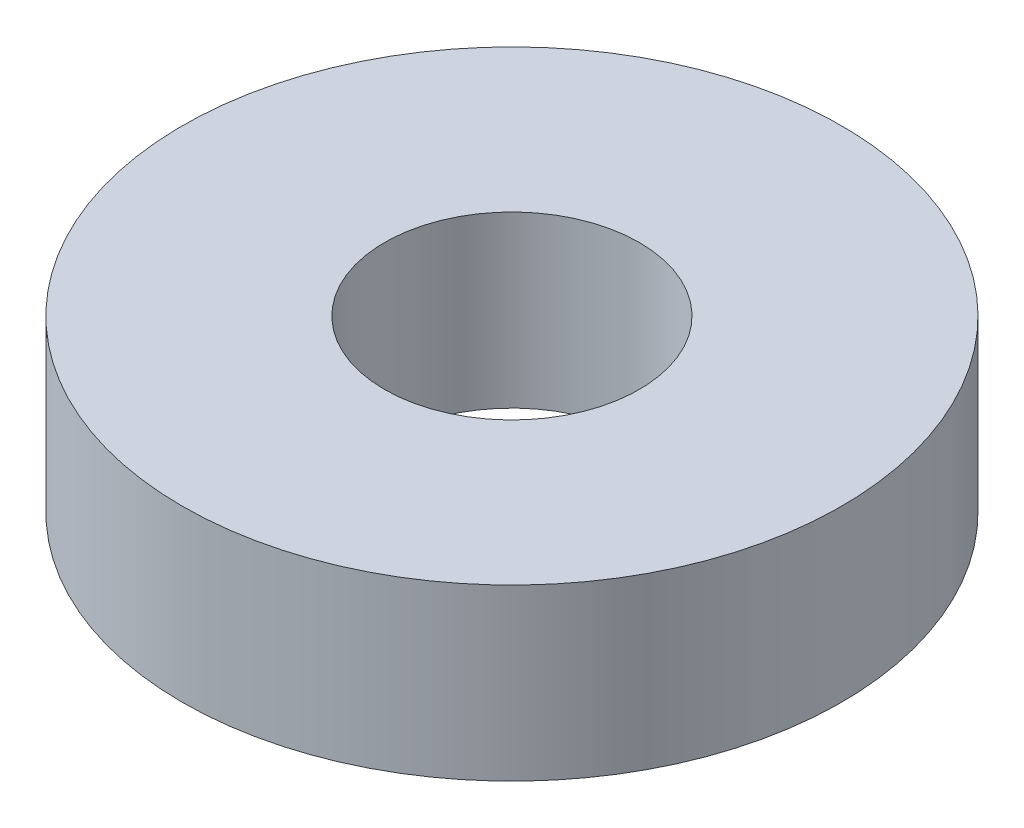
ISO-10303-21;
HEADER;
FILE_DESCRIPTION(('STEP AP214'),'2;1');
FILE_NAME('part.step','',(''),(''),'','','');
FILE_SCHEMA(('AUTOMOTIVE_DESIGN { 1 0 10303 214 1 1 1 1 }'));
ENDSEC;
DATA;
#1=APPLICATION_CONTEXT('core data for automotive mechanical design processes');
#2=APPLICATION_PROTOCOL_DEFINITION('international standard','automotive_design',2000,#1);
#3=PRODUCT_CONTEXT('',#1,'mechanical');
#4=PRODUCT('Part','Part','',(#3));
#5=PRODUCT_RELATED_PRODUCT_CATEGORY('part','',(#4));
#6=PRODUCT_DEFINITION_FORMATION('','',#4);
#7=PRODUCT_DEFINITION_CONTEXT('part definition',#1,'design');
#8=PRODUCT_DEFINITION('design','',#6,#7);
#9=PRODUCT_DEFINITION_SHAPE('','',#8);
#10=(LENGTH_UNIT() NAMED_UNIT(*) SI_UNIT(.MILLI.,.METRE.));
#11=(NAMED_UNIT(*) PLANE_ANGLE_UNIT() SI_UNIT($,.RADIAN.));
#12=(NAMED_UNIT(*) SI_UNIT($,.STERADIAN.) SOLID_ANGLE_UNIT());
#13=UNCERTAINTY_MEASURE_WITH_UNIT(LENGTH_MEASURE(1.E-05),#10,'distance_accuracy_value','');
#14=(GEOMETRIC_REPRESENTATION_CONTEXT(3) GLOBAL_UNCERTAINTY_ASSIGNED_CONTEXT((#13)) GLOBAL_UNIT_ASSIGNED_CONTEXT((#10,
#11,#12)) REPRESENTATION_CONTEXT('',''));
#15=CARTESIAN_POINT('',(0.,0.,0.));
#16=DIRECTION('',(0.,0.,1.));
#17=DIRECTION('',(1.,0.,0.));
#18=AXIS2_PLACEMENT_3D('',#15,#16,#17);
#19=CARTESIAN_POINT('',(0.,4.2,0.));
#20=DIRECTION('',(0.,1.,0.));
#21=DIRECTION('',(0.,0.,1.));
#22=AXIS2_PLACEMENT_3D('',#19,#20,#21);
#23=PLANE('',#22);
#24=CARTESIAN_POINT('',(0.,4.2,0.));
#25=DIRECTION('',(0.,1.,0.));
#26=DIRECTION('',(0.,0.,1.));
#27=AXIS2_PLACEMENT_3D('',#24,#25,#26);
#28=CIRCLE('',#27,8.15);
#29=CARTESIAN_POINT('',(0.,4.2,8.15));
#30=VERTEX_POINT('',#29);
#31=EDGE_CURVE('E10',#30,#30,#28,.T.);
#32=ORIENTED_EDGE('',*,*,#31,.T.);
#33=EDGE_LOOP('',(#32));
#34=FACE_BOUND('',#33,.T.);
#35=CARTESIAN_POINT('',(0.,4.2,0.));
#36=DIRECTION('',(0.,1.,0.));
#37=DIRECTION('',(0.,0.,1.));
#38=AXIS2_PLACEMENT_3D('',#35,#36,#37);
#39=CIRCLE('',#38,3.15);
#40=CARTESIAN_POINT('',(0.,4.2,3.15));
#41=VERTEX_POINT('',#40);
#42=EDGE_CURVE('E56',#41,#41,#39,.T.);
#43=ORIENTED_EDGE('',*,*,#42,.F.);
#44=EDGE_LOOP('',(#43));
#45=FACE_BOUND('',#44,.T.);
#46=ADVANCED_FACE('F43',(#34,#45),#23,.T.);
#47=CARTESIAN_POINT('',(0.,0.,0.));
#48=DIRECTION('',(0.,1.,0.));
#49=DIRECTION('',(0.,0.,1.));
#50=AXIS2_PLACEMENT_3D('',#47,#48,#49);
#51=PLANE('',#50);
#52=CARTESIAN_POINT('',(0.,0.,0.));
#53=DIRECTION('',(0.,1.,0.));
#54=DIRECTION('',(0.,0.,1.));
#55=AXIS2_PLACEMENT_3D('',#52,#53,#54);
#56=CIRCLE('',#55,8.15);
#57=CARTESIAN_POINT('',(0.,0.,8.15));
#58=VERTEX_POINT('',#57);
#59=EDGE_CURVE('E47',#58,#58,#56,.T.);
#60=ORIENTED_EDGE('',*,*,#59,.F.);
#61=EDGE_LOOP('',(#60));
#62=FACE_BOUND('',#61,.T.);
#63=CARTESIAN_POINT('',(0.,0.,0.));
#64=DIRECTION('',(0.,1.,0.));
#65=DIRECTION('',(0.,0.,1.));
#66=AXIS2_PLACEMENT_3D('',#63,#64,#65);
#67=CIRCLE('',#66,3.15);
#68=CARTESIAN_POINT('',(0.,0.,3.15));
#69=VERTEX_POINT('',#68);
#70=EDGE_CURVE('E58',#69,#69,#67,.T.);
#71=ORIENTED_EDGE('',*,*,#70,.T.);
#72=EDGE_LOOP('',(#71));
#73=FACE_BOUND('',#72,.T.);
#74=ADVANCED_FACE('F70',(#62,#73),#51,.F.);
#75=CARTESIAN_POINT('',(0.,4.2,0.));
#76=DIRECTION('',(0.,-1.,0.));
#77=DIRECTION('',(0.,0.,-1.));
#78=AXIS2_PLACEMENT_3D('',#75,#76,#77);
#79=CYLINDRICAL_SURFACE('',#78,8.15);
#80=ORIENTED_EDGE('',*,*,#31,.F.);
#81=EDGE_LOOP('',(#80));
#82=FACE_BOUND('',#81,.T.);
#83=ORIENTED_EDGE('',*,*,#59,.T.);
#84=EDGE_LOOP('',(#83));
#85=FACE_BOUND('',#84,.T.);
#86=ADVANCED_FACE('F45',(#82,#85),#79,.T.);
#87=CARTESIAN_POINT('',(0.,4.2,0.));
#88=DIRECTION('',(0.,-1.,0.));
#89=DIRECTION('',(0.,0.,-1.));
#90=AXIS2_PLACEMENT_3D('',#87,#88,#89);
#91=CYLINDRICAL_SURFACE('',#90,3.15);
#92=ORIENTED_EDGE('',*,*,#42,.T.);
#93=EDGE_LOOP('',(#92));
#94=FACE_BOUND('',#93,.T.);
#95=ORIENTED_EDGE('',*,*,#70,.F.);
#96=EDGE_LOOP('',(#95));
#97=FACE_BOUND('',#96,.T.);
#98=ADVANCED_FACE('F66',(#94,#97),#91,.F.);
#99=CLOSED_SHELL('',(#46,#74,#86,#98));
#100=MANIFOLD_SOLID_BREP('B2',#99);
#101=ADVANCED_BREP_SHAPE_REPRESENTATION('',(#18,#100),#14);
#102=SHAPE_DEFINITION_REPRESENTATION(#9,#101);
ENDSEC;
END-ISO-10303-21;
